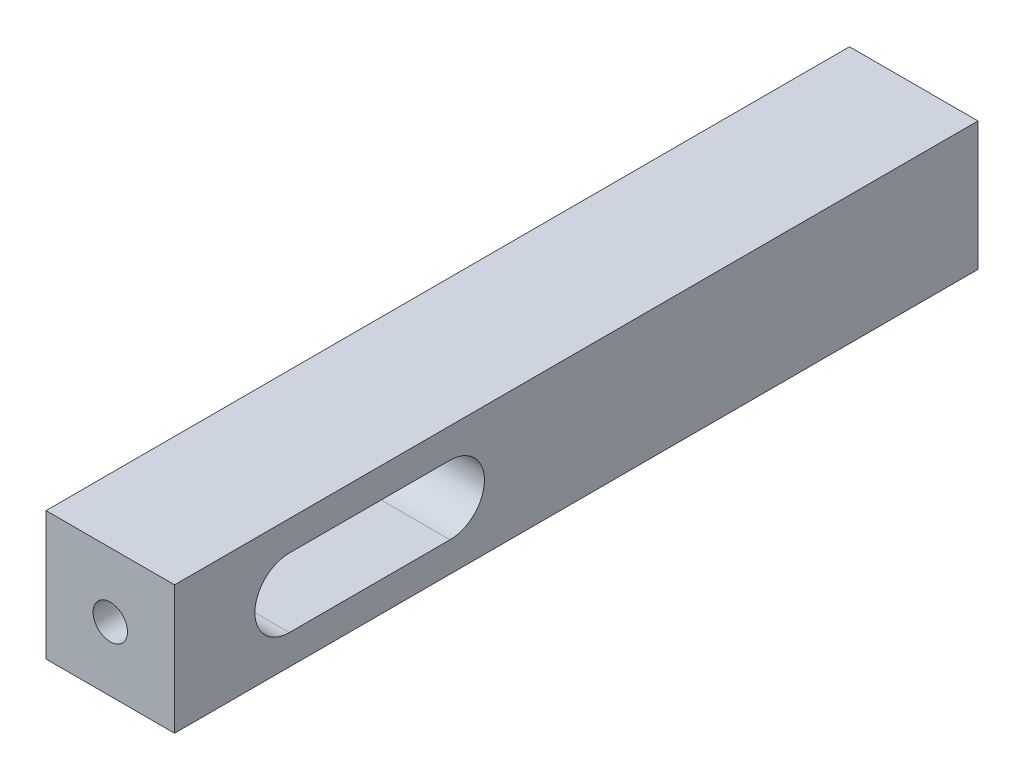
ISO-10303-21;
HEADER;
FILE_DESCRIPTION(('STEP AP214'),'2;1');
FILE_NAME('part.step','',(''),(''),'','','');
FILE_SCHEMA(('AUTOMOTIVE_DESIGN { 1 0 10303 214 1 1 1 1 }'));
ENDSEC;
DATA;
#1=APPLICATION_CONTEXT('core data for automotive mechanical design processes');
#2=APPLICATION_PROTOCOL_DEFINITION('international standard','automotive_design',2000,#1);
#3=PRODUCT_CONTEXT('',#1,'mechanical');
#4=PRODUCT('Part','Part','',(#3));
#5=PRODUCT_RELATED_PRODUCT_CATEGORY('part','',(#4));
#6=PRODUCT_DEFINITION_FORMATION('','',#4);
#7=PRODUCT_DEFINITION_CONTEXT('part definition',#1,'design');
#8=PRODUCT_DEFINITION('design','',#6,#7);
#9=PRODUCT_DEFINITION_SHAPE('','',#8);
#10=(LENGTH_UNIT() NAMED_UNIT(*) SI_UNIT(.MILLI.,.METRE.));
#11=(NAMED_UNIT(*) PLANE_ANGLE_UNIT() SI_UNIT($,.RADIAN.));
#12=(NAMED_UNIT(*) SI_UNIT($,.STERADIAN.) SOLID_ANGLE_UNIT());
#13=UNCERTAINTY_MEASURE_WITH_UNIT(LENGTH_MEASURE(1.E-05),#10,'distance_accuracy_value','');
#14=(GEOMETRIC_REPRESENTATION_CONTEXT(3) GLOBAL_UNCERTAINTY_ASSIGNED_CONTEXT((#13)) GLOBAL_UNIT_ASSIGNED_CONTEXT((#10,
#11,#12)) REPRESENTATION_CONTEXT('',''));
#15=CARTESIAN_POINT('',(0.,0.,0.));
#16=DIRECTION('',(0.,0.,1.));
#17=DIRECTION('',(1.,0.,0.));
#18=AXIS2_PLACEMENT_3D('',#15,#16,#17);
#19=CARTESIAN_POINT('',(0.,0.,35.));
#20=DIRECTION('',(0.,0.,-1.));
#21=DIRECTION('',(-1.,0.,0.));
#22=AXIS2_PLACEMENT_3D('',#19,#20,#21);
#23=CYLINDRICAL_SURFACE('',#22,0.75);
#24=CARTESIAN_POINT('',(-0.75,0.,21.5));
#25=CARTESIAN_POINT('',(-0.749997523260375,0.0394289722147399,21.5000021494689));
#26=CARTESIAN_POINT('',(-0.746872445158744,0.0789049497735245,21.5015713173536));
#27=CARTESIAN_POINT('',(-0.734510339744312,0.156690176451319,21.5076938297195));
#28=CARTESIAN_POINT('',(-0.725261705251763,0.194997065035128,21.5122528412826));
#29=CARTESIAN_POINT('',(-0.701104643537404,0.269200158660431,21.5238779044752));
#30=CARTESIAN_POINT('',(-0.686218211813991,0.305105102204385,21.5309342061686));
#31=CARTESIAN_POINT('',(-0.651322033976295,0.373854462604923,21.5469066761317));
#32=CARTESIAN_POINT('',(-0.631312691813361,0.406699120492537,21.5558226977485));
#33=CARTESIAN_POINT('',(-0.585362062886026,0.47063086332144,21.5753280630646));
#34=CARTESIAN_POINT('',(-0.559135140570268,0.501491408341584,21.5859860065435));
#35=CARTESIAN_POINT('',(-0.502108890564725,0.558584583650233,21.6075502231494));
#36=CARTESIAN_POINT('',(-0.471306111170669,0.584813687330075,21.6184566784322));
#37=CARTESIAN_POINT('',(-0.403137487857463,0.633939000337709,21.6402578660199));
#38=CARTESIAN_POINT('',(-0.365447926240564,0.656419001663728,21.651086097724));
#39=CARTESIAN_POINT('',(-0.286224498010338,0.694626170168022,21.6703551592076));
#40=CARTESIAN_POINT('',(-0.244693403457937,0.710358161224751,21.6787976929476));
#41=CARTESIAN_POINT('',(-0.161501170933557,0.733599331641442,21.6915659972164));
#42=CARTESIAN_POINT('',(-0.119996660949454,0.741544392810331,21.6961079631222));
#43=CARTESIAN_POINT('',(-0.0360158716653917,0.750320244981635,21.701135825386));
#44=CARTESIAN_POINT('',(0.0064594056533667,0.751158066279806,21.7016257299253));
#45=CARTESIAN_POINT('',(0.0857145182365266,0.746015465379221,21.6986680230706));
#46=CARTESIAN_POINT('',(0.122568023417288,0.740838419652616,21.6956842725349));
#47=CARTESIAN_POINT('',(0.194791432029782,0.725204886792699,21.6869282844961));
#48=CARTESIAN_POINT('',(0.230160858978987,0.714746717923239,21.6811551587617));
#49=CARTESIAN_POINT('',(0.299421849424245,0.688657335289503,21.6673439269044));
#50=CARTESIAN_POINT('',(0.333259799089342,0.672911300336996,21.65925619502));
#51=CARTESIAN_POINT('',(0.397975719442506,0.636781265751001,21.6417244678895));
#52=CARTESIAN_POINT('',(0.428852351700067,0.616395182859351,21.6322798641486));
#53=CARTESIAN_POINT('',(0.49089093955742,0.568549541184591,21.6116513157254));
#54=CARTESIAN_POINT('',(0.521592655182118,0.540520843776961,21.6003986732244));
#55=CARTESIAN_POINT('',(0.578051563943177,0.47966668405603,21.5783928252469));
#56=CARTESIAN_POINT('',(0.603806394025413,0.446838942430713,21.567639860309));
#57=CARTESIAN_POINT('',(0.650764245772296,0.375387379373886,21.5472350953778));
#58=CARTESIAN_POINT('',(0.671700354334305,0.336565193699556,21.5376576187849));
#59=CARTESIAN_POINT('',(0.706572771782257,0.255349661616598,21.5213158915907));
#60=CARTESIAN_POINT('',(0.720514638761376,0.212959182198957,21.5145494079234));
#61=CARTESIAN_POINT('',(0.739856552787507,0.129574868745526,21.5050674969392));
#62=CARTESIAN_POINT('',(0.745868426810084,0.088756147911243,21.5020629627402));
#63=CARTESIAN_POINT('',(0.751098548350868,0.00658469996201519,21.4994523990567));
#64=CARTESIAN_POINT('',(0.750320014229609,-0.0347677649024261,21.4998447595902));
#65=CARTESIAN_POINT('',(0.742344983685935,-0.113424728989495,21.5038160580992));
#66=CARTESIAN_POINT('',(0.735650600452477,-0.150794556037465,21.5071456573386));
#67=CARTESIAN_POINT('',(0.716821446078686,-0.223805169226437,21.5163337151389));
#68=CARTESIAN_POINT('',(0.704686075159981,-0.259445764268248,21.5221924524925));
#69=CARTESIAN_POINT('',(0.675001150175121,-0.329166456337249,21.5361181143975));
#70=CARTESIAN_POINT('',(0.65730671241239,-0.363172797754615,21.5442433867255));
#71=CARTESIAN_POINT('',(0.617169348265469,-0.427846021274191,21.5619201926217));
#72=CARTESIAN_POINT('',(0.594724399054927,-0.458511472331461,21.5714723332566));
#73=CARTESIAN_POINT('',(0.543179681000345,-0.51882576696799,21.592188339969));
#74=CARTESIAN_POINT('',(0.513642848659825,-0.54807905836848,21.6034183636367));
#75=CARTESIAN_POINT('',(0.450056136548021,-0.601392240834931,21.6255320629709));
#76=CARTESIAN_POINT('',(0.416003160887719,-0.625448539268131,21.6364154946386));
#77=CARTESIAN_POINT('',(0.342267259349766,-0.668780935873272,21.6571160583045));
#78=CARTESIAN_POINT('',(0.302391550343553,-0.687769121908978,21.666856027524));
#79=CARTESIAN_POINT('',(0.219367449230608,-0.718562119510353,21.6831944572391));
#80=CARTESIAN_POINT('',(0.176223355124109,-0.730376186915678,21.6897969631954));
#81=CARTESIAN_POINT('',(0.0923173328539129,-0.745396265587259,21.698288742435));
#82=CARTESIAN_POINT('',(0.0517243099282223,-0.749319747300649,21.7005696240463));
#83=CARTESIAN_POINT('',(-0.0295853003780469,-0.75051686578559,21.7012598401537));
#84=CARTESIAN_POINT('',(-0.0703018265545756,-0.747793384968299,21.6996708527934));
#85=CARTESIAN_POINT('',(-0.146612626149012,-0.736444594194197,21.6932160346248));
#86=CARTESIAN_POINT('',(-0.182325352608301,-0.7284062357571,21.6886767913821));
#87=CARTESIAN_POINT('',(-0.25185608956853,-0.707381518668484,21.6772173785906));
#88=CARTESIAN_POINT('',(-0.285673486568976,-0.694393568369857,21.6702964432274));
#89=CARTESIAN_POINT('',(-0.352968638239955,-0.662861808975512,21.654286022266));
#90=CARTESIAN_POINT('',(-0.386270926372276,-0.644003353362343,21.6450820820286));
#91=CARTESIAN_POINT('',(-0.44945590213544,-0.601613228727476,21.6257350127406));
#92=CARTESIAN_POINT('',(-0.479336797888868,-0.578079128428986,21.6155913965411));
#93=CARTESIAN_POINT('',(-0.538606486768212,-0.523652494998481,21.5940325763052));
#94=CARTESIAN_POINT('',(-0.567494326771442,-0.492213317257628,21.582612625164));
#95=CARTESIAN_POINT('',(-0.619697237567725,-0.42461610466521,21.5609168580868));
#96=CARTESIAN_POINT('',(-0.643009304569717,-0.388455542442589,21.5506416604397));
#97=CARTESIAN_POINT('',(-0.683427272071653,-0.31194869761496,21.5322649281117));
#98=CARTESIAN_POINT('',(-0.700488127058576,-0.271574627950961,21.5241792757782));
#99=CARTESIAN_POINT('',(-0.727356125939214,-0.188056575970643,21.511239939774));
#100=CARTESIAN_POINT('',(-0.737183885122184,-0.144920849717374,21.506377074703));
#101=CARTESIAN_POINT('',(-0.745423058306887,-0.0844514598625371,21.5022840356775));
#102=CARTESIAN_POINT('',(-0.747136980647715,-0.0676214095796234,21.501429759956));
#103=CARTESIAN_POINT('',(-0.749425999137605,-0.0338637988553679,21.500287272666));
#104=CARTESIAN_POINT('',(-0.7500010638534,-0.0169362357355359,21.4999990767218));
#105=CARTESIAN_POINT('',(-0.75,0.,21.5));
#106=B_SPLINE_CURVE_WITH_KNOTS('',3,(#24,#25,#26,#27,#28,#29,#30,#31,#32,#33,#34,#35,#36,#37,
#38,#39,#40,#41,#42,#43,#44,#45,#46,#47,#48,#49,#50,#51,#52,#53,#54,#55,#56,#57,#58,#59,#60,#61,
#62,#63,#64,#65,#66,#67,#68,#69,#70,#71,#72,#73,#74,#75,#76,#77,#78,#79,#80,#81,#82,#83,#84,#85,
#86,#87,#88,#89,#90,#91,#92,#93,#94,#95,#96,#97,#98,#99,#100,#101,#102,#103,#104,#105),
.UNSPECIFIED.,.T.,.F.,(4,2,2,2,2,2,2,2,2,2,2,2,2,2,2,2,2,2,2,2,2,2,2,2,2,2,2,2,2,2,2,2,2,2,2,2,
2,2,2,2,4),(0.,0.11821819306522,0.236661112281899,0.354646616619223,0.472622820436176,
0.597736319038566,0.722944678240527,0.857862948230646,0.992684609237107,1.11943509105172,
1.24606017996765,1.3575428430699,1.46906102944259,1.58317680126365,1.69734390945166,
1.82598706000409,1.95469150949015,2.0893726666083,2.2239466268421,2.34737467853509,
2.47074423383607,2.58455179879591,2.69837191223199,2.81544642020924,2.93257088061254,
3.06119707983314,3.18991191461574,3.32486011619756,3.45963383955583,3.5814698062378,
3.70325294895004,3.81343447683137,3.92365146587759,4.04127342581711,4.15895670854218,
4.29093932064374,4.4229928753243,4.55598010247194,4.68858681468698,4.73936460103273,
4.79014378886135),.UNSPECIFIED.);
#107=CARTESIAN_POINT('',(-0.75,0.,21.5));
#108=VERTEX_POINT('',#107);
#109=EDGE_CURVE('E36',#108,#108,#106,.T.);
#110=ORIENTED_EDGE('',*,*,#109,.F.);
#111=EDGE_LOOP('',(#110));
#112=FACE_BOUND('',#111,.T.);
#113=CARTESIAN_POINT('',(0.,0.,0.));
#114=DIRECTION('',(0.,0.,1.));
#115=DIRECTION('',(1.,0.,0.));
#116=AXIS2_PLACEMENT_3D('',#113,#114,#115);
#117=CIRCLE('',#116,0.75);
#118=CARTESIAN_POINT('',(0.75,0.,0.));
#119=VERTEX_POINT('',#118);
#120=EDGE_CURVE('E143',#119,#119,#117,.T.);
#121=ORIENTED_EDGE('',*,*,#120,.F.);
#122=EDGE_LOOP('',(#121));
#123=FACE_BOUND('',#122,.T.);
#124=ADVANCED_FACE('F32',(#112,#123),#23,.F.);
#125=CARTESIAN_POINT('',(0.,0.,35.));
#126=DIRECTION('',(0.,0.,1.));
#127=DIRECTION('',(1.,0.,0.));
#128=AXIS2_PLACEMENT_3D('',#125,#126,#127);
#129=PLANE('',#128);
#130=DIRECTION('',(0.,1.,0.));
#131=VECTOR('',#130,1.);
#132=CARTESIAN_POINT('',(2.8,2.8,35.));
#133=LINE('',#132,#131);
#134=CARTESIAN_POINT('',(2.8,-2.8,35.));
#135=VERTEX_POINT('',#134);
#136=CARTESIAN_POINT('',(2.8,2.8,35.));
#137=VERTEX_POINT('',#136);
#138=EDGE_CURVE('E146',#135,#137,#133,.T.);
#139=ORIENTED_EDGE('',*,*,#138,.T.);
#140=DIRECTION('',(-1.,0.,0.));
#141=VECTOR('',#140,1.);
#142=CARTESIAN_POINT('',(-2.8,2.8,35.));
#143=LINE('',#142,#141);
#144=CARTESIAN_POINT('',(-2.8,2.8,35.));
#145=VERTEX_POINT('',#144);
#146=EDGE_CURVE('E149',#137,#145,#143,.T.);
#147=ORIENTED_EDGE('',*,*,#146,.T.);
#148=DIRECTION('',(0.,-1.,0.));
#149=VECTOR('',#148,1.);
#150=CARTESIAN_POINT('',(-2.8,2.8,35.));
#151=LINE('',#150,#149);
#152=CARTESIAN_POINT('',(-2.8,-2.8,35.));
#153=VERTEX_POINT('',#152);
#154=EDGE_CURVE('E152',#145,#153,#151,.T.);
#155=ORIENTED_EDGE('',*,*,#154,.T.);
#156=DIRECTION('',(1.,0.,0.));
#157=VECTOR('',#156,1.);
#158=CARTESIAN_POINT('',(-2.8,-2.8,35.));
#159=LINE('',#158,#157);
#160=EDGE_CURVE('E154',#153,#135,#159,.T.);
#161=ORIENTED_EDGE('',*,*,#160,.T.);
#162=EDGE_LOOP('',(#139,#147,#155,#161));
#163=FACE_BOUND('',#162,.T.);
#164=CARTESIAN_POINT('',(0.,0.,35.));
#165=DIRECTION('',(0.,0.,1.));
#166=DIRECTION('',(1.,0.,0.));
#167=AXIS2_PLACEMENT_3D('',#164,#165,#166);
#168=CIRCLE('',#167,0.75);
#169=CARTESIAN_POINT('',(0.75,0.,35.));
#170=VERTEX_POINT('',#169);
#171=EDGE_CURVE('E139',#170,#170,#168,.T.);
#172=ORIENTED_EDGE('',*,*,#171,.F.);
#173=EDGE_LOOP('',(#172));
#174=FACE_BOUND('',#173,.T.);
#175=ADVANCED_FACE('F197',(#163,#174),#129,.T.);
#176=CARTESIAN_POINT('',(0.,0.,0.));
#177=DIRECTION('',(0.,0.,1.));
#178=DIRECTION('',(1.,0.,0.));
#179=AXIS2_PLACEMENT_3D('',#176,#177,#178);
#180=PLANE('',#179);
#181=DIRECTION('',(0.,1.,0.));
#182=VECTOR('',#181,1.);
#183=CARTESIAN_POINT('',(2.8,2.8,0.));
#184=LINE('',#183,#182);
#185=CARTESIAN_POINT('',(2.8,-2.8,0.));
#186=VERTEX_POINT('',#185);
#187=CARTESIAN_POINT('',(2.8,2.8,0.));
#188=VERTEX_POINT('',#187);
#189=EDGE_CURVE('E142',#186,#188,#184,.T.);
#190=ORIENTED_EDGE('',*,*,#189,.F.);
#191=DIRECTION('',(1.,0.,0.));
#192=VECTOR('',#191,1.);
#193=CARTESIAN_POINT('',(-2.8,-2.8,0.));
#194=LINE('',#193,#192);
#195=CARTESIAN_POINT('',(-2.8,-2.8,0.));
#196=VERTEX_POINT('',#195);
#197=EDGE_CURVE('E150',#196,#186,#194,.T.);
#198=ORIENTED_EDGE('',*,*,#197,.F.);
#199=DIRECTION('',(0.,-1.,0.));
#200=VECTOR('',#199,1.);
#201=CARTESIAN_POINT('',(-2.8,2.8,0.));
#202=LINE('',#201,#200);
#203=CARTESIAN_POINT('',(-2.8,2.8,0.));
#204=VERTEX_POINT('',#203);
#205=EDGE_CURVE('E161',#204,#196,#202,.T.);
#206=ORIENTED_EDGE('',*,*,#205,.F.);
#207=DIRECTION('',(-1.,0.,0.));
#208=VECTOR('',#207,1.);
#209=CARTESIAN_POINT('',(-2.8,2.8,0.));
#210=LINE('',#209,#208);
#211=EDGE_CURVE('E159',#188,#204,#210,.T.);
#212=ORIENTED_EDGE('',*,*,#211,.F.);
#213=EDGE_LOOP('',(#190,#198,#206,#212));
#214=FACE_BOUND('',#213,.T.);
#215=ORIENTED_EDGE('',*,*,#120,.T.);
#216=EDGE_LOOP('',(#215));
#217=FACE_BOUND('',#216,.T.);
#218=ADVANCED_FACE('F202',(#214,#217),#180,.F.);
#219=CARTESIAN_POINT('',(2.8,2.8,35.));
#220=DIRECTION('',(-1.,0.,0.));
#221=DIRECTION('',(0.,-1.,0.));
#222=AXIS2_PLACEMENT_3D('',#219,#220,#221);
#223=PLANE('',#222);
#224=DIRECTION('',(0.,0.,-1.));
#225=VECTOR('',#224,1.);
#226=CARTESIAN_POINT('',(2.8,1.5,23.));
#227=LINE('',#226,#225);
#228=CARTESIAN_POINT('',(2.8,1.5,30.));
#229=VERTEX_POINT('',#228);
#230=CARTESIAN_POINT('',(2.8,1.5,23.));
#231=VERTEX_POINT('',#230);
#232=EDGE_CURVE('E111',#229,#231,#227,.T.);
#233=ORIENTED_EDGE('',*,*,#232,.T.);
#234=CARTESIAN_POINT('',(2.8,0.,23.));
#235=DIRECTION('',(-1.,0.,0.));
#236=DIRECTION('',(0.,-1.,0.));
#237=AXIS2_PLACEMENT_3D('',#234,#235,#236);
#238=CIRCLE('',#237,1.5);
#239=CARTESIAN_POINT('',(2.8,-1.5,23.));
#240=VERTEX_POINT('',#239);
#241=EDGE_CURVE('E105',#231,#240,#238,.T.);
#242=ORIENTED_EDGE('',*,*,#241,.T.);
#243=DIRECTION('',(0.,0.,1.));
#244=VECTOR('',#243,1.);
#245=CARTESIAN_POINT('',(2.8,-1.5,23.));
#246=LINE('',#245,#244);
#247=CARTESIAN_POINT('',(2.8,-1.5,30.));
#248=VERTEX_POINT('',#247);
#249=EDGE_CURVE('E114',#240,#248,#246,.T.);
#250=ORIENTED_EDGE('',*,*,#249,.T.);
#251=CARTESIAN_POINT('',(2.8,0.,30.));
#252=DIRECTION('',(-1.,0.,0.));
#253=DIRECTION('',(0.,-1.,0.));
#254=AXIS2_PLACEMENT_3D('',#251,#252,#253);
#255=CIRCLE('',#254,1.5);
#256=EDGE_CURVE('E53',#248,#229,#255,.T.);
#257=ORIENTED_EDGE('',*,*,#256,.T.);
#258=EDGE_LOOP('',(#233,#242,#250,#257));
#259=FACE_BOUND('',#258,.T.);
#260=ORIENTED_EDGE('',*,*,#189,.T.);
#261=DIRECTION('',(0.,0.,-1.));
#262=VECTOR('',#261,1.);
#263=CARTESIAN_POINT('',(2.8,2.8,35.));
#264=LINE('',#263,#262);
#265=EDGE_CURVE('E11',#137,#188,#264,.T.);
#266=ORIENTED_EDGE('',*,*,#265,.F.);
#267=ORIENTED_EDGE('',*,*,#138,.F.);
#268=DIRECTION('',(0.,0.,-1.));
#269=VECTOR('',#268,1.);
#270=CARTESIAN_POINT('',(2.8,-2.8,35.));
#271=LINE('',#270,#269);
#272=EDGE_CURVE('E156',#135,#186,#271,.T.);
#273=ORIENTED_EDGE('',*,*,#272,.T.);
#274=EDGE_LOOP('',(#260,#266,#267,#273));
#275=FACE_BOUND('',#274,.T.);
#276=ADVANCED_FACE('F34',(#259,#275),#223,.F.);
#277=CARTESIAN_POINT('',(-2.8,2.8,35.));
#278=DIRECTION('',(0.,-1.,0.));
#279=DIRECTION('',(0.,0.,-1.));
#280=AXIS2_PLACEMENT_3D('',#277,#278,#279);
#281=PLANE('',#280);
#282=ORIENTED_EDGE('',*,*,#211,.T.);
#283=DIRECTION('',(0.,0.,-1.));
#284=VECTOR('',#283,1.);
#285=CARTESIAN_POINT('',(-2.8,2.8,35.));
#286=LINE('',#285,#284);
#287=EDGE_CURVE('E45',#145,#204,#286,.T.);
#288=ORIENTED_EDGE('',*,*,#287,.F.);
#289=ORIENTED_EDGE('',*,*,#146,.F.);
#290=ORIENTED_EDGE('',*,*,#265,.T.);
#291=EDGE_LOOP('',(#282,#288,#289,#290));
#292=FACE_BOUND('',#291,.T.);
#293=ADVANCED_FACE('F214',(#292),#281,.F.);
#294=CARTESIAN_POINT('',(-2.8,2.8,35.));
#295=DIRECTION('',(1.,0.,0.));
#296=DIRECTION('',(0.,1.,0.));
#297=AXIS2_PLACEMENT_3D('',#294,#295,#296);
#298=PLANE('',#297);
#299=DIRECTION('',(0.,0.,1.));
#300=VECTOR('',#299,1.);
#301=CARTESIAN_POINT('',(-2.8,-1.5,23.));
#302=LINE('',#301,#300);
#303=CARTESIAN_POINT('',(-2.8,-1.5,23.));
#304=VERTEX_POINT('',#303);
#305=CARTESIAN_POINT('',(-2.8,-1.5,30.));
#306=VERTEX_POINT('',#305);
#307=EDGE_CURVE('E129',#304,#306,#302,.T.);
#308=ORIENTED_EDGE('',*,*,#307,.F.);
#309=CARTESIAN_POINT('',(-2.8,0.,23.));
#310=DIRECTION('',(-1.,0.,0.));
#311=DIRECTION('',(0.,-1.,0.));
#312=AXIS2_PLACEMENT_3D('',#309,#310,#311);
#313=CIRCLE('',#312,1.5);
#314=CARTESIAN_POINT('',(-2.8,1.5,23.));
#315=VERTEX_POINT('',#314);
#316=EDGE_CURVE('E61',#315,#304,#313,.T.);
#317=ORIENTED_EDGE('',*,*,#316,.F.);
#318=DIRECTION('',(0.,0.,-1.));
#319=VECTOR('',#318,1.);
#320=CARTESIAN_POINT('',(-2.8,1.5,23.));
#321=LINE('',#320,#319);
#322=CARTESIAN_POINT('',(-2.8,1.5,30.));
#323=VERTEX_POINT('',#322);
#324=EDGE_CURVE('E120',#323,#315,#321,.T.);
#325=ORIENTED_EDGE('',*,*,#324,.F.);
#326=CARTESIAN_POINT('',(-2.8,0.,30.));
#327=DIRECTION('',(-1.,0.,0.));
#328=DIRECTION('',(0.,-1.,0.));
#329=AXIS2_PLACEMENT_3D('',#326,#327,#328);
#330=CIRCLE('',#329,1.5);
#331=EDGE_CURVE('E123',#306,#323,#330,.T.);
#332=ORIENTED_EDGE('',*,*,#331,.F.);
#333=EDGE_LOOP('',(#308,#317,#325,#332));
#334=FACE_BOUND('',#333,.T.);
#335=ORIENTED_EDGE('',*,*,#205,.T.);
#336=DIRECTION('',(0.,0.,-1.));
#337=VECTOR('',#336,1.);
#338=CARTESIAN_POINT('',(-2.8,-2.8,35.));
#339=LINE('',#338,#337);
#340=EDGE_CURVE('E166',#153,#196,#339,.T.);
#341=ORIENTED_EDGE('',*,*,#340,.F.);
#342=ORIENTED_EDGE('',*,*,#154,.F.);
#343=ORIENTED_EDGE('',*,*,#287,.T.);
#344=EDGE_LOOP('',(#335,#341,#342,#343));
#345=FACE_BOUND('',#344,.T.);
#346=ADVANCED_FACE('F219',(#334,#345),#298,.F.);
#347=CARTESIAN_POINT('',(-2.8,-2.8,35.));
#348=DIRECTION('',(0.,1.,0.));
#349=DIRECTION('',(0.,0.,1.));
#350=AXIS2_PLACEMENT_3D('',#347,#348,#349);
#351=PLANE('',#350);
#352=ORIENTED_EDGE('',*,*,#197,.T.);
#353=ORIENTED_EDGE('',*,*,#272,.F.);
#354=ORIENTED_EDGE('',*,*,#160,.F.);
#355=ORIENTED_EDGE('',*,*,#340,.T.);
#356=EDGE_LOOP('',(#352,#353,#354,#355));
#357=FACE_BOUND('',#356,.T.);
#358=ADVANCED_FACE('F193',(#357),#351,.F.);
#359=CARTESIAN_POINT('',(-0.75,0.,31.5));
#360=CARTESIAN_POINT('',(-0.749997523260375,-0.0394289722147399,31.4999978505311));
#361=CARTESIAN_POINT('',(-0.746872445158744,-0.0789049497735245,31.4984286826464));
#362=CARTESIAN_POINT('',(-0.734510339744312,-0.156690176451319,31.4923061702805));
#363=CARTESIAN_POINT('',(-0.725261705251763,-0.194997065035128,31.4877471587174));
#364=CARTESIAN_POINT('',(-0.701104643537404,-0.269200158660432,31.4761220955248));
#365=CARTESIAN_POINT('',(-0.68621821181399,-0.305105102204386,31.4690657938314));
#366=CARTESIAN_POINT('',(-0.651322033976294,-0.373854462604925,31.4530933238683));
#367=CARTESIAN_POINT('',(-0.631312691813361,-0.406699120492537,31.4441773022515));
#368=CARTESIAN_POINT('',(-0.585362062886027,-0.470630863321438,31.4246719369354));
#369=CARTESIAN_POINT('',(-0.559135140570269,-0.501491408341583,31.4140139934565));
#370=CARTESIAN_POINT('',(-0.502108890564726,-0.558584583650232,31.3924497768506));
#371=CARTESIAN_POINT('',(-0.471306111170671,-0.584813687330074,31.3815433215678));
#372=CARTESIAN_POINT('',(-0.403137487857465,-0.633939000337708,31.3597421339801));
#373=CARTESIAN_POINT('',(-0.365447926240567,-0.656419001663727,31.348913902276));
#374=CARTESIAN_POINT('',(-0.286224498010341,-0.694626170168021,31.3296448407924));
#375=CARTESIAN_POINT('',(-0.244693403457939,-0.71035816122475,31.3212023070524));
#376=CARTESIAN_POINT('',(-0.161501170933559,-0.733599331641441,31.3084340027836));
#377=CARTESIAN_POINT('',(-0.119996660949455,-0.741544392810331,31.3038920368779));
#378=CARTESIAN_POINT('',(-0.0360158716653928,-0.750320244981635,31.298864174614));
#379=CARTESIAN_POINT('',(0.00645940565336566,-0.751158066279806,31.2983742700747));
#380=CARTESIAN_POINT('',(0.085714518236526,-0.746015465379221,31.3013319769294));
#381=CARTESIAN_POINT('',(0.122568023417288,-0.740838419652616,31.3043157274651));
#382=CARTESIAN_POINT('',(0.194791432029782,-0.725204886792699,31.3130717155039));
#383=CARTESIAN_POINT('',(0.230160858978987,-0.714746717923239,31.3188448412383));
#384=CARTESIAN_POINT('',(0.299421849424244,-0.688657335289503,31.3326560730956));
#385=CARTESIAN_POINT('',(0.333259799089341,-0.672911300336996,31.34074380498));
#386=CARTESIAN_POINT('',(0.397975719442506,-0.636781265751002,31.3582755321105));
#387=CARTESIAN_POINT('',(0.428852351700067,-0.616395182859351,31.3677201358514));
#388=CARTESIAN_POINT('',(0.49089093955742,-0.568549541184591,31.3883486842746));
#389=CARTESIAN_POINT('',(0.521592655182119,-0.540520843776961,31.3996013267756));
#390=CARTESIAN_POINT('',(0.578051563943176,-0.47966668405603,31.4216071747531));
#391=CARTESIAN_POINT('',(0.603806394025412,-0.446838942430715,31.432360139691));
#392=CARTESIAN_POINT('',(0.650764245772295,-0.375387379373888,31.4527649046222));
#393=CARTESIAN_POINT('',(0.671700354334305,-0.336565193699558,31.4623423812151));
#394=CARTESIAN_POINT('',(0.706572771782257,-0.255349661616598,31.4786841084093));
#395=CARTESIAN_POINT('',(0.720514638761376,-0.212959182198957,31.4854505920766));
#396=CARTESIAN_POINT('',(0.739856552787507,-0.129574868745525,31.4949325030608));
#397=CARTESIAN_POINT('',(0.745868426810084,-0.0887561479112422,31.4979370372598));
#398=CARTESIAN_POINT('',(0.751098548350868,-0.0065846999620145,31.5005476009433));
#399=CARTESIAN_POINT('',(0.750320014229609,0.0347677649024266,31.5001552404098));
#400=CARTESIAN_POINT('',(0.742344983685935,0.113424728989496,31.4961839419008));
#401=CARTESIAN_POINT('',(0.735650600452477,0.150794556037466,31.4928543426614));
#402=CARTESIAN_POINT('',(0.716821446078686,0.223805169226438,31.4836662848611));
#403=CARTESIAN_POINT('',(0.704686075159981,0.259445764268248,31.4778075475075));
#404=CARTESIAN_POINT('',(0.675001150175121,0.329166456337249,31.4638818856025));
#405=CARTESIAN_POINT('',(0.65730671241239,0.363172797754616,31.4557566132745));
#406=CARTESIAN_POINT('',(0.617169348265468,0.427846021274191,31.4380798073783));
#407=CARTESIAN_POINT('',(0.594724399054926,0.458511472331462,31.4285276667434));
#408=CARTESIAN_POINT('',(0.543179681000345,0.51882576696799,31.407811660031));
#409=CARTESIAN_POINT('',(0.513642848659826,0.548079058368479,31.3965816363633));
#410=CARTESIAN_POINT('',(0.450056136548022,0.601392240834929,31.3744679370291));
#411=CARTESIAN_POINT('',(0.41600316088772,0.62544853926813,31.3635845053615));
#412=CARTESIAN_POINT('',(0.342267259349767,0.668780935873272,31.3428839416955));
#413=CARTESIAN_POINT('',(0.302391550343554,0.687769121908978,31.333143972476));
#414=CARTESIAN_POINT('',(0.219367449230608,0.718562119510352,31.3168055427609));
#415=CARTESIAN_POINT('',(0.17622335512411,0.730376186915678,31.3102030368046));
#416=CARTESIAN_POINT('',(0.0923173328539136,0.745396265587259,31.301711257565));
#417=CARTESIAN_POINT('',(0.0517243099282225,0.749319747300649,31.2994303759537));
#418=CARTESIAN_POINT('',(-0.0295853003780471,0.750516865785591,31.2987401598463));
#419=CARTESIAN_POINT('',(-0.0703018265545758,0.747793384968299,31.3003291472067));
#420=CARTESIAN_POINT('',(-0.146612626149012,0.736444594194197,31.3067839653752));
#421=CARTESIAN_POINT('',(-0.1823253526083,0.7284062357571,31.311323208618));
#422=CARTESIAN_POINT('',(-0.25185608956853,0.707381518668484,31.3227826214094));
#423=CARTESIAN_POINT('',(-0.285673486568975,0.694393568369858,31.3297035567726));
#424=CARTESIAN_POINT('',(-0.352968638239953,0.662861808975513,31.345713977734));
#425=CARTESIAN_POINT('',(-0.386270926372272,0.644003353362345,31.3549179179714));
#426=CARTESIAN_POINT('',(-0.449455902135437,0.601613228727478,31.3742649872594));
#427=CARTESIAN_POINT('',(-0.479336797888866,0.578079128428987,31.3844086034589));
#428=CARTESIAN_POINT('',(-0.538606486768211,0.523652494998481,31.4059674236949));
#429=CARTESIAN_POINT('',(-0.567494326771441,0.492213317257629,31.417387374836));
#430=CARTESIAN_POINT('',(-0.619697237567724,0.424616104665211,31.4390831419132));
#431=CARTESIAN_POINT('',(-0.643009304569716,0.388455542442589,31.4493583395603));
#432=CARTESIAN_POINT('',(-0.683427272071653,0.31194869761496,31.4677350718883));
#433=CARTESIAN_POINT('',(-0.700488127058576,0.271574627950961,31.4758207242218));
#434=CARTESIAN_POINT('',(-0.727356125939214,0.188056575970644,31.488760060226));
#435=CARTESIAN_POINT('',(-0.737183885122183,0.144920849717375,31.493622925297));
#436=CARTESIAN_POINT('',(-0.745423058306887,0.0844514598625378,31.4977159643225));
#437=CARTESIAN_POINT('',(-0.747136980647715,0.0676214095796238,31.498570240044));
#438=CARTESIAN_POINT('',(-0.749425999137605,0.033863798855368,31.499712727334));
#439=CARTESIAN_POINT('',(-0.7500010638534,0.0169362357355359,31.5000009232782));
#440=CARTESIAN_POINT('',(-0.75,0.,31.5));
#441=B_SPLINE_CURVE_WITH_KNOTS('',3,(#359,#360,#361,#362,#363,#364,#365,#366,#367,#368,#369,
#370,#371,#372,#373,#374,#375,#376,#377,#378,#379,#380,#381,#382,#383,#384,#385,#386,#387,#388,
#389,#390,#391,#392,#393,#394,#395,#396,#397,#398,#399,#400,#401,#402,#403,#404,#405,#406,#407,
#408,#409,#410,#411,#412,#413,#414,#415,#416,#417,#418,#419,#420,#421,#422,#423,#424,#425,#426,
#427,#428,#429,#430,#431,#432,#433,#434,#435,#436,#437,#438,#439,#440),.UNSPECIFIED.,.T.,.F.,(4,
2,2,2,2,2,2,2,2,2,2,2,2,2,2,2,2,2,2,2,2,2,2,2,2,2,2,2,2,2,2,2,2,2,2,2,2,2,2,2,4),(0.,
0.118218193065219,0.236661112281898,0.354646616619226,0.472622820436176,0.597736319038564,
0.722944678240524,0.857862948230643,0.992684609237107,1.11943509105172,1.24606017996765,
1.3575428430699,1.46906102944259,1.58317680126366,1.69734390945166,1.82598706000409,
1.95469150949015,2.0893726666083,2.2239466268421,2.34737467853509,2.47074423383607,
2.58455179879592,2.69837191223199,2.81544642020924,2.93257088061255,3.06119707983314,
3.18991191461574,3.32486011619756,3.45963383955583,3.5814698062378,3.70325294895004,
3.81343447683137,3.92365146587759,4.0412734258171,4.15895670854218,4.29093932064374,
4.4229928753243,4.55598010247194,4.68858681468698,4.73936460103273,4.79014378886135),.UNSPECIFIED.);
#442=CARTESIAN_POINT('',(-0.75,0.,31.5));
#443=VERTEX_POINT('',#442);
#444=EDGE_CURVE('E135',#443,#443,#441,.T.);
#445=ORIENTED_EDGE('',*,*,#444,.F.);
#446=EDGE_LOOP('',(#445));
#447=FACE_BOUND('',#446,.T.);
#448=ORIENTED_EDGE('',*,*,#171,.T.);
#449=EDGE_LOOP('',(#448));
#450=FACE_BOUND('',#449,.T.);
#451=ADVANCED_FACE('F174',(#447,#450),#23,.F.);
#452=CARTESIAN_POINT('',(2.8,0.,23.));
#453=DIRECTION('',(-1.,0.,0.));
#454=DIRECTION('',(0.,-1.,0.));
#455=AXIS2_PLACEMENT_3D('',#452,#453,#454);
#456=CYLINDRICAL_SURFACE('',#455,1.5);
#457=ORIENTED_EDGE('',*,*,#109,.T.);
#458=EDGE_LOOP('',(#457));
#459=FACE_BOUND('',#458,.T.);
#460=ORIENTED_EDGE('',*,*,#316,.T.);
#461=DIRECTION('',(-1.,0.,0.));
#462=VECTOR('',#461,1.);
#463=CARTESIAN_POINT('',(2.8,-1.5,23.));
#464=LINE('',#463,#462);
#465=EDGE_CURVE('E101',#240,#304,#464,.T.);
#466=ORIENTED_EDGE('',*,*,#465,.F.);
#467=ORIENTED_EDGE('',*,*,#241,.F.);
#468=DIRECTION('',(-1.,0.,0.));
#469=VECTOR('',#468,1.);
#470=CARTESIAN_POINT('',(2.8,1.5,23.));
#471=LINE('',#470,#469);
#472=EDGE_CURVE('E133',#231,#315,#471,.T.);
#473=ORIENTED_EDGE('',*,*,#472,.T.);
#474=EDGE_LOOP('',(#460,#466,#467,#473));
#475=FACE_BOUND('',#474,.T.);
#476=ADVANCED_FACE('F103',(#459,#475),#456,.F.);
#477=CARTESIAN_POINT('',(2.8,1.5,23.));
#478=DIRECTION('',(0.,1.,0.));
#479=DIRECTION('',(-1.,0.,0.));
#480=AXIS2_PLACEMENT_3D('',#477,#478,#479);
#481=PLANE('',#480);
#482=ORIENTED_EDGE('',*,*,#324,.T.);
#483=ORIENTED_EDGE('',*,*,#472,.F.);
#484=ORIENTED_EDGE('',*,*,#232,.F.);
#485=DIRECTION('',(-1.,0.,0.));
#486=VECTOR('',#485,1.);
#487=CARTESIAN_POINT('',(2.8,1.5,30.));
#488=LINE('',#487,#486);
#489=EDGE_CURVE('E136',#229,#323,#488,.T.);
#490=ORIENTED_EDGE('',*,*,#489,.T.);
#491=EDGE_LOOP('',(#482,#483,#484,#490));
#492=FACE_BOUND('',#491,.T.);
#493=ADVANCED_FACE('F182',(#492),#481,.F.);
#494=CARTESIAN_POINT('',(2.8,0.,30.));
#495=DIRECTION('',(-1.,0.,0.));
#496=DIRECTION('',(0.,-1.,0.));
#497=AXIS2_PLACEMENT_3D('',#494,#495,#496);
#498=CYLINDRICAL_SURFACE('',#497,1.5);
#499=ORIENTED_EDGE('',*,*,#444,.T.);
#500=EDGE_LOOP('',(#499));
#501=FACE_BOUND('',#500,.T.);
#502=ORIENTED_EDGE('',*,*,#331,.T.);
#503=ORIENTED_EDGE('',*,*,#489,.F.);
#504=ORIENTED_EDGE('',*,*,#256,.F.);
#505=DIRECTION('',(-1.,0.,0.));
#506=VECTOR('',#505,1.);
#507=CARTESIAN_POINT('',(2.8,-1.5,30.));
#508=LINE('',#507,#506);
#509=EDGE_CURVE('E110',#248,#306,#508,.T.);
#510=ORIENTED_EDGE('',*,*,#509,.T.);
#511=EDGE_LOOP('',(#502,#503,#504,#510));
#512=FACE_BOUND('',#511,.T.);
#513=ADVANCED_FACE('F177',(#501,#512),#498,.F.);
#514=CARTESIAN_POINT('',(2.8,-1.5,23.));
#515=DIRECTION('',(0.,-1.,0.));
#516=DIRECTION('',(1.,0.,0.));
#517=AXIS2_PLACEMENT_3D('',#514,#515,#516);
#518=PLANE('',#517);
#519=ORIENTED_EDGE('',*,*,#307,.T.);
#520=ORIENTED_EDGE('',*,*,#509,.F.);
#521=ORIENTED_EDGE('',*,*,#249,.F.);
#522=ORIENTED_EDGE('',*,*,#465,.T.);
#523=EDGE_LOOP('',(#519,#520,#521,#522));
#524=FACE_BOUND('',#523,.T.);
#525=ADVANCED_FACE('F115',(#524),#518,.F.);
#526=CLOSED_SHELL('',(#124,#175,#218,#276,#293,#346,#358,#451,#476,#493,#513,#525));
#527=MANIFOLD_SOLID_BREP('B2',#526);
#528=ADVANCED_BREP_SHAPE_REPRESENTATION('',(#18,#527),#14);
#529=SHAPE_DEFINITION_REPRESENTATION(#9,#528);
ENDSEC;
END-ISO-10303-21;
